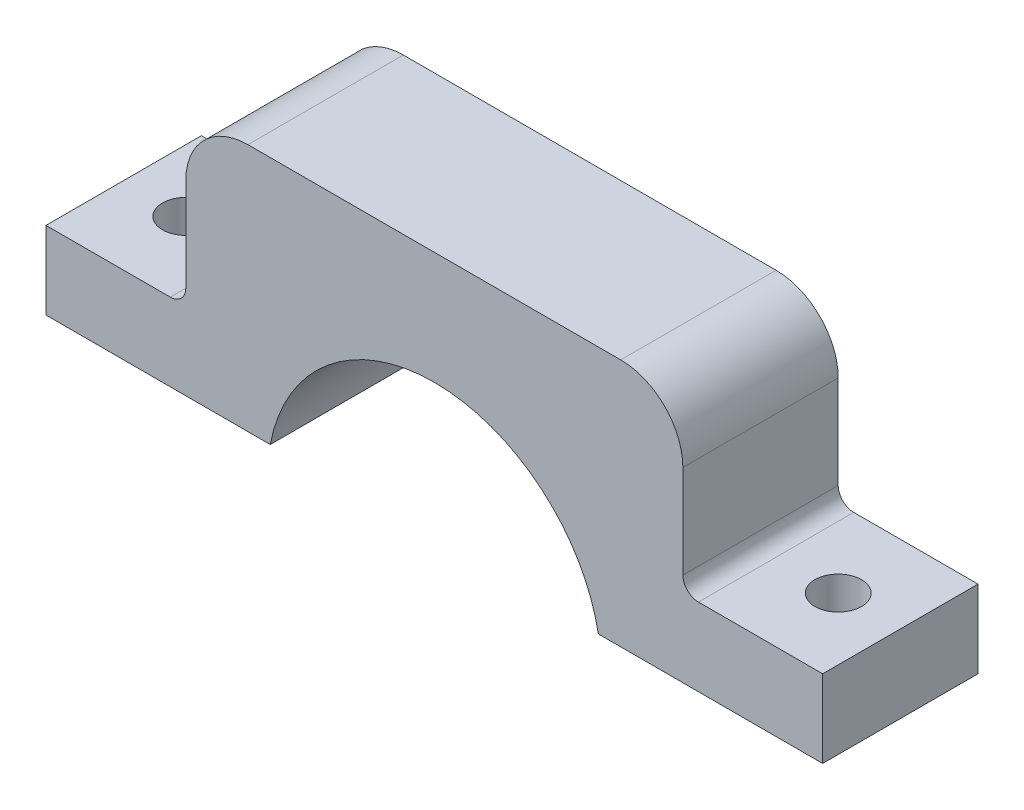
ISO-10303-21;
HEADER;
FILE_DESCRIPTION(('STEP AP214'),'2;1');
FILE_NAME('part.step','',(''),(''),'','','');
FILE_SCHEMA(('AUTOMOTIVE_DESIGN { 1 0 10303 214 1 1 1 1 }'));
ENDSEC;
DATA;
#1=APPLICATION_CONTEXT('core data for automotive mechanical design processes');
#2=APPLICATION_PROTOCOL_DEFINITION('international standard','automotive_design',2000,#1);
#3=PRODUCT_CONTEXT('',#1,'mechanical');
#4=PRODUCT('Part','Part','',(#3));
#5=PRODUCT_RELATED_PRODUCT_CATEGORY('part','',(#4));
#6=PRODUCT_DEFINITION_FORMATION('','',#4);
#7=PRODUCT_DEFINITION_CONTEXT('part definition',#1,'design');
#8=PRODUCT_DEFINITION('design','',#6,#7);
#9=PRODUCT_DEFINITION_SHAPE('','',#8);
#10=(LENGTH_UNIT() NAMED_UNIT(*) SI_UNIT(.MILLI.,.METRE.));
#11=(NAMED_UNIT(*) PLANE_ANGLE_UNIT() SI_UNIT($,.RADIAN.));
#12=(NAMED_UNIT(*) SI_UNIT($,.STERADIAN.) SOLID_ANGLE_UNIT());
#13=UNCERTAINTY_MEASURE_WITH_UNIT(LENGTH_MEASURE(1.E-05),#10,'distance_accuracy_value','');
#14=(GEOMETRIC_REPRESENTATION_CONTEXT(3) GLOBAL_UNCERTAINTY_ASSIGNED_CONTEXT((#13)) GLOBAL_UNIT_ASSIGNED_CONTEXT((#10,
#11,#12)) REPRESENTATION_CONTEXT('',''));
#15=CARTESIAN_POINT('',(0.,0.,0.));
#16=DIRECTION('',(0.,0.,1.));
#17=DIRECTION('',(1.,0.,0.));
#18=AXIS2_PLACEMENT_3D('',#15,#16,#17);
#19=CARTESIAN_POINT('',(16.,0.,10.));
#20=DIRECTION('',(-1.,0.,0.));
#21=DIRECTION('',(0.,0.,1.));
#22=AXIS2_PLACEMENT_3D('',#19,#20,#21);
#23=PLANE('',#22);
#24=DIRECTION('',(0.,1.,0.));
#25=VECTOR('',#24,1.);
#26=CARTESIAN_POINT('',(16.,0.,0.));
#27=LINE('',#26,#25);
#28=CARTESIAN_POINT('',(16.,8.,0.));
#29=VERTEX_POINT('',#28);
#30=CARTESIAN_POINT('',(16.,14.,0.));
#31=VERTEX_POINT('',#30);
#32=EDGE_CURVE('E239',#29,#31,#27,.T.);
#33=ORIENTED_EDGE('',*,*,#32,.T.);
#34=DIRECTION('',(0.,0.,-1.));
#35=VECTOR('',#34,1.);
#36=CARTESIAN_POINT('',(16.,14.,10.));
#37=LINE('',#36,#35);
#38=CARTESIAN_POINT('',(16.,14.,10.));
#39=VERTEX_POINT('',#38);
#40=EDGE_CURVE('E64',#31,#39,#37,.F.);
#41=ORIENTED_EDGE('',*,*,#40,.T.);
#42=DIRECTION('',(0.,1.,0.));
#43=VECTOR('',#42,1.);
#44=CARTESIAN_POINT('',(16.,0.,10.));
#45=LINE('',#44,#43);
#46=CARTESIAN_POINT('',(16.,8.,10.));
#47=VERTEX_POINT('',#46);
#48=EDGE_CURVE('E225',#47,#39,#45,.T.);
#49=ORIENTED_EDGE('',*,*,#48,.F.);
#50=DIRECTION('',(0.,0.,1.));
#51=VECTOR('',#50,1.);
#52=CARTESIAN_POINT('',(16.,8.,10.));
#53=LINE('',#52,#51);
#54=EDGE_CURVE('E255',#47,#29,#53,.F.);
#55=ORIENTED_EDGE('',*,*,#54,.T.);
#56=EDGE_LOOP('',(#33,#41,#49,#55));
#57=FACE_BOUND('',#56,.T.);
#58=ADVANCED_FACE('F40',(#57),#23,.F.);
#59=CARTESIAN_POINT('',(-16.,0.,10.));
#60=DIRECTION('',(-1.,0.,0.));
#61=DIRECTION('',(0.,0.,1.));
#62=AXIS2_PLACEMENT_3D('',#59,#60,#61);
#63=PLANE('',#62);
#64=DIRECTION('',(0.,1.,0.));
#65=VECTOR('',#64,1.);
#66=CARTESIAN_POINT('',(-16.,0.,10.));
#67=LINE('',#66,#65);
#68=CARTESIAN_POINT('',(-16.,8.,10.));
#69=VERTEX_POINT('',#68);
#70=CARTESIAN_POINT('',(-16.,14.,10.));
#71=VERTEX_POINT('',#70);
#72=EDGE_CURVE('E232',#69,#71,#67,.T.);
#73=ORIENTED_EDGE('',*,*,#72,.T.);
#74=DIRECTION('',(0.,0.,-1.));
#75=VECTOR('',#74,1.);
#76=CARTESIAN_POINT('',(-16.,14.,0.));
#77=LINE('',#76,#75);
#78=CARTESIAN_POINT('',(-16.,14.,0.));
#79=VERTEX_POINT('',#78);
#80=EDGE_CURVE('E11',#71,#79,#77,.T.);
#81=ORIENTED_EDGE('',*,*,#80,.T.);
#82=DIRECTION('',(0.,1.,0.));
#83=VECTOR('',#82,1.);
#84=CARTESIAN_POINT('',(-16.,0.,0.));
#85=LINE('',#84,#83);
#86=CARTESIAN_POINT('',(-16.,8.,0.));
#87=VERTEX_POINT('',#86);
#88=EDGE_CURVE('E226',#87,#79,#85,.T.);
#89=ORIENTED_EDGE('',*,*,#88,.F.);
#90=DIRECTION('',(0.,0.,1.));
#91=VECTOR('',#90,1.);
#92=CARTESIAN_POINT('',(-16.,8.,10.));
#93=LINE('',#92,#91);
#94=EDGE_CURVE('E258',#87,#69,#93,.T.);
#95=ORIENTED_EDGE('',*,*,#94,.T.);
#96=EDGE_LOOP('',(#73,#81,#89,#95));
#97=FACE_BOUND('',#96,.T.);
#98=ADVANCED_FACE('F336',(#97),#63,.T.);
#99=CARTESIAN_POINT('',(0.,0.,10.));
#100=DIRECTION('',(0.,0.,-1.));
#101=DIRECTION('',(-1.,0.,0.));
#102=AXIS2_PLACEMENT_3D('',#99,#100,#101);
#103=CYLINDRICAL_SURFACE('',#102,10.75);
#104=DIRECTION('',(0.,0.,-1.));
#105=VECTOR('',#104,1.);
#106=CARTESIAN_POINT('',(10.5623150871388,2.,10.));
#107=LINE('',#106,#105);
#108=CARTESIAN_POINT('',(10.5623150871388,2.,10.));
#109=VERTEX_POINT('',#108);
#110=CARTESIAN_POINT('',(10.5623150871388,2.,0.));
#111=VERTEX_POINT('',#110);
#112=EDGE_CURVE('E219',#109,#111,#107,.T.);
#113=ORIENTED_EDGE('',*,*,#112,.F.);
#114=CARTESIAN_POINT('',(0.,0.,10.));
#115=DIRECTION('',(0.,0.,1.));
#116=DIRECTION('',(1.,0.,0.));
#117=AXIS2_PLACEMENT_3D('',#114,#115,#116);
#118=CIRCLE('',#117,10.75);
#119=CARTESIAN_POINT('',(-10.5623150871388,2.,10.));
#120=VERTEX_POINT('',#119);
#121=EDGE_CURVE('E153',#109,#120,#118,.T.);
#122=ORIENTED_EDGE('',*,*,#121,.T.);
#123=DIRECTION('',(0.,0.,-1.));
#124=VECTOR('',#123,1.);
#125=CARTESIAN_POINT('',(-10.5623150871388,2.,10.));
#126=LINE('',#125,#124);
#127=CARTESIAN_POINT('',(-10.5623150871388,2.,0.));
#128=VERTEX_POINT('',#127);
#129=EDGE_CURVE('E215',#128,#120,#126,.F.);
#130=ORIENTED_EDGE('',*,*,#129,.F.);
#131=CARTESIAN_POINT('',(0.,0.,0.));
#132=DIRECTION('',(0.,0.,1.));
#133=DIRECTION('',(1.,0.,0.));
#134=AXIS2_PLACEMENT_3D('',#131,#132,#133);
#135=CIRCLE('',#134,10.75);
#136=EDGE_CURVE('E222',#111,#128,#135,.T.);
#137=ORIENTED_EDGE('',*,*,#136,.F.);
#138=EDGE_LOOP('',(#113,#122,#130,#137));
#139=FACE_BOUND('',#138,.T.);
#140=ADVANCED_FACE('F350',(#139),#103,.F.);
#141=CARTESIAN_POINT('',(0.,18.,10.));
#142=DIRECTION('',(0.,-1.,0.));
#143=DIRECTION('',(0.,0.,-1.));
#144=AXIS2_PLACEMENT_3D('',#141,#142,#143);
#145=PLANE('',#144);
#146=DIRECTION('',(-1.,0.,0.));
#147=VECTOR('',#146,1.);
#148=CARTESIAN_POINT('',(0.,18.,10.));
#149=LINE('',#148,#147);
#150=CARTESIAN_POINT('',(12.,18.,10.));
#151=VERTEX_POINT('',#150);
#152=CARTESIAN_POINT('',(-12.,18.,10.));
#153=VERTEX_POINT('',#152);
#154=EDGE_CURVE('E229',#151,#153,#149,.T.);
#155=ORIENTED_EDGE('',*,*,#154,.F.);
#156=DIRECTION('',(0.,0.,-1.));
#157=VECTOR('',#156,1.);
#158=CARTESIAN_POINT('',(12.,18.,10.));
#159=LINE('',#158,#157);
#160=CARTESIAN_POINT('',(12.,18.,0.));
#161=VERTEX_POINT('',#160);
#162=EDGE_CURVE('E280',#151,#161,#159,.T.);
#163=ORIENTED_EDGE('',*,*,#162,.T.);
#164=DIRECTION('',(-1.,0.,0.));
#165=VECTOR('',#164,1.);
#166=CARTESIAN_POINT('',(0.,18.,0.));
#167=LINE('',#166,#165);
#168=CARTESIAN_POINT('',(-12.,18.,0.));
#169=VERTEX_POINT('',#168);
#170=EDGE_CURVE('E242',#161,#169,#167,.T.);
#171=ORIENTED_EDGE('',*,*,#170,.T.);
#172=DIRECTION('',(0.,0.,-1.));
#173=VECTOR('',#172,1.);
#174=CARTESIAN_POINT('',(-12.,18.,10.));
#175=LINE('',#174,#173);
#176=EDGE_CURVE('E277',#169,#153,#175,.F.);
#177=ORIENTED_EDGE('',*,*,#176,.T.);
#178=EDGE_LOOP('',(#155,#163,#171,#177));
#179=FACE_BOUND('',#178,.T.);
#180=ADVANCED_FACE('F299',(#179),#145,.F.);
#181=CARTESIAN_POINT('',(0.,0.,10.));
#182=DIRECTION('',(0.,0.,1.));
#183=DIRECTION('',(1.,0.,0.));
#184=AXIS2_PLACEMENT_3D('',#181,#182,#183);
#185=PLANE('',#184);
#186=ORIENTED_EDGE('',*,*,#48,.T.);
#187=CARTESIAN_POINT('',(12.,14.,10.));
#188=DIRECTION('',(0.,0.,1.));
#189=DIRECTION('',(1.,0.,0.));
#190=AXIS2_PLACEMENT_3D('',#187,#188,#189);
#191=CIRCLE('',#190,4.);
#192=EDGE_CURVE('E49',#39,#151,#191,.T.);
#193=ORIENTED_EDGE('',*,*,#192,.T.);
#194=ORIENTED_EDGE('',*,*,#154,.T.);
#195=CARTESIAN_POINT('',(-12.,14.,10.));
#196=DIRECTION('',(0.,0.,1.));
#197=DIRECTION('',(1.,0.,0.));
#198=AXIS2_PLACEMENT_3D('',#195,#196,#197);
#199=CIRCLE('',#198,4.);
#200=EDGE_CURVE('E56',#153,#71,#199,.T.);
#201=ORIENTED_EDGE('',*,*,#200,.T.);
#202=ORIENTED_EDGE('',*,*,#72,.F.);
#203=CARTESIAN_POINT('',(-17.,8.,10.));
#204=DIRECTION('',(0.,0.,1.));
#205=DIRECTION('',(1.,0.,0.));
#206=AXIS2_PLACEMENT_3D('',#203,#204,#205);
#207=CIRCLE('',#206,1.);
#208=CARTESIAN_POINT('',(-17.,7.,10.));
#209=VERTEX_POINT('',#208);
#210=EDGE_CURVE('E271',#69,#209,#207,.F.);
#211=ORIENTED_EDGE('',*,*,#210,.T.);
#212=DIRECTION('',(-1.,0.,0.));
#213=VECTOR('',#212,1.);
#214=CARTESIAN_POINT('',(-16.,7.,10.));
#215=LINE('',#214,#213);
#216=CARTESIAN_POINT('',(-25.,7.,10.));
#217=VERTEX_POINT('',#216);
#218=EDGE_CURVE('E192',#209,#217,#215,.T.);
#219=ORIENTED_EDGE('',*,*,#218,.T.);
#220=DIRECTION('',(0.,-1.,0.));
#221=VECTOR('',#220,1.);
#222=CARTESIAN_POINT('',(-25.,2.,10.));
#223=LINE('',#222,#221);
#224=CARTESIAN_POINT('',(-25.,2.,10.));
#225=VERTEX_POINT('',#224);
#226=EDGE_CURVE('E200',#217,#225,#223,.T.);
#227=ORIENTED_EDGE('',*,*,#226,.T.);
#228=DIRECTION('',(-1.,0.,0.));
#229=VECTOR('',#228,1.);
#230=CARTESIAN_POINT('',(-16.,2.,10.));
#231=LINE('',#230,#229);
#232=EDGE_CURVE('E158',#120,#225,#231,.T.);
#233=ORIENTED_EDGE('',*,*,#232,.F.);
#234=ORIENTED_EDGE('',*,*,#121,.F.);
#235=CARTESIAN_POINT('',(25.,2.,10.));
#236=VERTEX_POINT('',#235);
#237=EDGE_CURVE('E145',#236,#109,#231,.T.);
#238=ORIENTED_EDGE('',*,*,#237,.F.);
#239=DIRECTION('',(0.,1.,0.));
#240=VECTOR('',#239,1.);
#241=CARTESIAN_POINT('',(25.,2.,10.));
#242=LINE('',#241,#240);
#243=CARTESIAN_POINT('',(25.,7.,10.));
#244=VERTEX_POINT('',#243);
#245=EDGE_CURVE('E150',#236,#244,#242,.T.);
#246=ORIENTED_EDGE('',*,*,#245,.T.);
#247=DIRECTION('',(-1.,0.,0.));
#248=VECTOR('',#247,1.);
#249=CARTESIAN_POINT('',(16.,7.,10.));
#250=LINE('',#249,#248);
#251=CARTESIAN_POINT('',(17.,7.,10.));
#252=VERTEX_POINT('',#251);
#253=EDGE_CURVE('E169',#244,#252,#250,.T.);
#254=ORIENTED_EDGE('',*,*,#253,.T.);
#255=CARTESIAN_POINT('',(17.,8.,10.));
#256=DIRECTION('',(0.,0.,1.));
#257=DIRECTION('',(1.,0.,0.));
#258=AXIS2_PLACEMENT_3D('',#255,#256,#257);
#259=CIRCLE('',#258,1.);
#260=EDGE_CURVE('E265',#252,#47,#259,.F.);
#261=ORIENTED_EDGE('',*,*,#260,.T.);
#262=EDGE_LOOP('',(#186,#193,#194,#201,#202,#211,#219,#227,#233,#234,#238,#246,#254,#261));
#263=FACE_BOUND('',#262,.T.);
#264=ADVANCED_FACE('F147',(#263),#185,.T.);
#265=CARTESIAN_POINT('',(0.,0.,0.));
#266=DIRECTION('',(0.,0.,1.));
#267=DIRECTION('',(1.,0.,0.));
#268=AXIS2_PLACEMENT_3D('',#265,#266,#267);
#269=PLANE('',#268);
#270=ORIENTED_EDGE('',*,*,#170,.F.);
#271=CARTESIAN_POINT('',(12.,14.,0.));
#272=DIRECTION('',(0.,0.,1.));
#273=DIRECTION('',(1.,0.,0.));
#274=AXIS2_PLACEMENT_3D('',#271,#272,#273);
#275=CIRCLE('',#274,4.);
#276=EDGE_CURVE('E287',#161,#31,#275,.F.);
#277=ORIENTED_EDGE('',*,*,#276,.T.);
#278=ORIENTED_EDGE('',*,*,#32,.F.);
#279=CARTESIAN_POINT('',(17.,8.,0.));
#280=DIRECTION('',(0.,0.,1.));
#281=DIRECTION('',(1.,0.,0.));
#282=AXIS2_PLACEMENT_3D('',#279,#280,#281);
#283=CIRCLE('',#282,1.);
#284=CARTESIAN_POINT('',(17.,7.,0.));
#285=VERTEX_POINT('',#284);
#286=EDGE_CURVE('E268',#29,#285,#283,.T.);
#287=ORIENTED_EDGE('',*,*,#286,.T.);
#288=DIRECTION('',(1.,0.,0.));
#289=VECTOR('',#288,1.);
#290=CARTESIAN_POINT('',(16.,7.,0.));
#291=LINE('',#290,#289);
#292=CARTESIAN_POINT('',(25.,7.,0.));
#293=VERTEX_POINT('',#292);
#294=EDGE_CURVE('E184',#285,#293,#291,.T.);
#295=ORIENTED_EDGE('',*,*,#294,.T.);
#296=DIRECTION('',(0.,-1.,0.));
#297=VECTOR('',#296,1.);
#298=CARTESIAN_POINT('',(25.,2.,0.));
#299=LINE('',#298,#297);
#300=CARTESIAN_POINT('',(25.,2.,0.));
#301=VERTEX_POINT('',#300);
#302=EDGE_CURVE('E189',#293,#301,#299,.T.);
#303=ORIENTED_EDGE('',*,*,#302,.T.);
#304=DIRECTION('',(-1.,0.,0.));
#305=VECTOR('',#304,1.);
#306=CARTESIAN_POINT('',(-16.,2.,0.));
#307=LINE('',#306,#305);
#308=EDGE_CURVE('E157',#301,#111,#307,.T.);
#309=ORIENTED_EDGE('',*,*,#308,.T.);
#310=ORIENTED_EDGE('',*,*,#136,.T.);
#311=DIRECTION('',(-1.,0.,0.));
#312=VECTOR('',#311,1.);
#313=CARTESIAN_POINT('',(0.,2.,0.));
#314=LINE('',#313,#312);
#315=CARTESIAN_POINT('',(-25.,2.,0.));
#316=VERTEX_POINT('',#315);
#317=EDGE_CURVE('E235',#128,#316,#314,.T.);
#318=ORIENTED_EDGE('',*,*,#317,.T.);
#319=DIRECTION('',(0.,1.,0.));
#320=VECTOR('',#319,1.);
#321=CARTESIAN_POINT('',(-25.,2.,0.));
#322=LINE('',#321,#320);
#323=CARTESIAN_POINT('',(-25.,7.,0.));
#324=VERTEX_POINT('',#323);
#325=EDGE_CURVE('E193',#316,#324,#322,.T.);
#326=ORIENTED_EDGE('',*,*,#325,.T.);
#327=DIRECTION('',(1.,0.,0.));
#328=VECTOR('',#327,1.);
#329=CARTESIAN_POINT('',(-16.,7.,0.));
#330=LINE('',#329,#328);
#331=CARTESIAN_POINT('',(-17.,7.,0.));
#332=VERTEX_POINT('',#331);
#333=EDGE_CURVE('E196',#324,#332,#330,.T.);
#334=ORIENTED_EDGE('',*,*,#333,.T.);
#335=CARTESIAN_POINT('',(-17.,8.,0.));
#336=DIRECTION('',(0.,0.,1.));
#337=DIRECTION('',(1.,0.,0.));
#338=AXIS2_PLACEMENT_3D('',#335,#336,#337);
#339=CIRCLE('',#338,1.);
#340=EDGE_CURVE('E274',#332,#87,#339,.T.);
#341=ORIENTED_EDGE('',*,*,#340,.T.);
#342=ORIENTED_EDGE('',*,*,#88,.T.);
#343=CARTESIAN_POINT('',(-12.,14.,0.));
#344=DIRECTION('',(0.,0.,1.));
#345=DIRECTION('',(1.,0.,0.));
#346=AXIS2_PLACEMENT_3D('',#343,#344,#345);
#347=CIRCLE('',#346,4.);
#348=EDGE_CURVE('E284',#79,#169,#347,.F.);
#349=ORIENTED_EDGE('',*,*,#348,.T.);
#350=EDGE_LOOP('',(#270,#277,#278,#287,#295,#303,#309,#310,#318,#326,#334,#341,#342,#349));
#351=FACE_BOUND('',#350,.T.);
#352=ADVANCED_FACE('F305',(#351),#269,.F.);
#353=CARTESIAN_POINT('',(-16.,2.,0.));
#354=DIRECTION('',(0.,1.,0.));
#355=DIRECTION('',(0.,0.,1.));
#356=AXIS2_PLACEMENT_3D('',#353,#354,#355);
#357=PLANE('',#356);
#358=CARTESIAN_POINT('',(-21.,1.99999999999999,5.));
#359=DIRECTION('',(0.,1.,0.));
#360=DIRECTION('',(1.,0.,0.));
#361=AXIS2_PLACEMENT_3D('',#358,#359,#360);
#362=CIRCLE('',#361,1.5);
#363=CARTESIAN_POINT('',(-19.5,1.99999999999999,5.));
#364=VERTEX_POINT('',#363);
#365=EDGE_CURVE('E512',#364,#364,#362,.T.);
#366=ORIENTED_EDGE('',*,*,#365,.T.);
#367=EDGE_LOOP('',(#366));
#368=FACE_BOUND('',#367,.T.);
#369=ORIENTED_EDGE('',*,*,#129,.T.);
#370=ORIENTED_EDGE('',*,*,#232,.T.);
#371=DIRECTION('',(0.,0.,1.));
#372=VECTOR('',#371,1.);
#373=CARTESIAN_POINT('',(-25.,2.,-10.295630140987));
#374=LINE('',#373,#372);
#375=EDGE_CURVE('E197',#316,#225,#374,.T.);
#376=ORIENTED_EDGE('',*,*,#375,.F.);
#377=ORIENTED_EDGE('',*,*,#317,.F.);
#378=EDGE_LOOP('',(#369,#370,#376,#377));
#379=FACE_BOUND('',#378,.T.);
#380=ADVANCED_FACE('F318',(#368,#379),#357,.F.);
#381=CARTESIAN_POINT('',(21.,2.,5.));
#382=DIRECTION('',(0.,1.,0.));
#383=DIRECTION('',(-1.,0.,0.));
#384=AXIS2_PLACEMENT_3D('',#381,#382,#383);
#385=CIRCLE('',#384,1.5);
#386=CARTESIAN_POINT('',(19.5,2.,5.));
#387=VERTEX_POINT('',#386);
#388=EDGE_CURVE('E175',#387,#387,#385,.T.);
#389=ORIENTED_EDGE('',*,*,#388,.T.);
#390=EDGE_LOOP('',(#389));
#391=FACE_BOUND('',#390,.T.);
#392=ORIENTED_EDGE('',*,*,#112,.T.);
#393=ORIENTED_EDGE('',*,*,#308,.F.);
#394=DIRECTION('',(0.,0.,1.));
#395=VECTOR('',#394,1.);
#396=CARTESIAN_POINT('',(25.,2.,-10.295630140987));
#397=LINE('',#396,#395);
#398=EDGE_CURVE('E161',#301,#236,#397,.T.);
#399=ORIENTED_EDGE('',*,*,#398,.T.);
#400=ORIENTED_EDGE('',*,*,#237,.T.);
#401=EDGE_LOOP('',(#392,#393,#399,#400));
#402=FACE_BOUND('',#401,.T.);
#403=ADVANCED_FACE('F162',(#391,#402),#357,.F.);
#404=CARTESIAN_POINT('',(-25.,2.,-10.295630140987));
#405=DIRECTION('',(-1.,0.,0.));
#406=DIRECTION('',(0.,0.,1.));
#407=AXIS2_PLACEMENT_3D('',#404,#405,#406);
#408=PLANE('',#407);
#409=ORIENTED_EDGE('',*,*,#325,.F.);
#410=ORIENTED_EDGE('',*,*,#375,.T.);
#411=ORIENTED_EDGE('',*,*,#226,.F.);
#412=DIRECTION('',(0.,0.,1.));
#413=VECTOR('',#412,1.);
#414=CARTESIAN_POINT('',(-25.,7.,-10.295630140987));
#415=LINE('',#414,#413);
#416=EDGE_CURVE('E204',#324,#217,#415,.T.);
#417=ORIENTED_EDGE('',*,*,#416,.F.);
#418=EDGE_LOOP('',(#409,#410,#411,#417));
#419=FACE_BOUND('',#418,.T.);
#420=ADVANCED_FACE('F323',(#419),#408,.T.);
#421=CARTESIAN_POINT('',(-16.,7.,-10.295630140987));
#422=DIRECTION('',(0.,1.,0.));
#423=DIRECTION('',(-1.,0.,0.));
#424=AXIS2_PLACEMENT_3D('',#421,#422,#423);
#425=PLANE('',#424);
#426=CARTESIAN_POINT('',(-21.,7.,5.));
#427=DIRECTION('',(0.,1.,0.));
#428=DIRECTION('',(1.,0.,0.));
#429=AXIS2_PLACEMENT_3D('',#426,#427,#428);
#430=CIRCLE('',#429,1.5);
#431=CARTESIAN_POINT('',(-19.5,7.,5.));
#432=VERTEX_POINT('',#431);
#433=EDGE_CURVE('E514',#432,#432,#430,.T.);
#434=ORIENTED_EDGE('',*,*,#433,.F.);
#435=EDGE_LOOP('',(#434));
#436=FACE_BOUND('',#435,.T.);
#437=ORIENTED_EDGE('',*,*,#218,.F.);
#438=DIRECTION('',(0.,0.,1.));
#439=VECTOR('',#438,1.);
#440=CARTESIAN_POINT('',(-17.,7.,0.));
#441=LINE('',#440,#439);
#442=EDGE_CURVE('E262',#209,#332,#441,.F.);
#443=ORIENTED_EDGE('',*,*,#442,.T.);
#444=ORIENTED_EDGE('',*,*,#333,.F.);
#445=ORIENTED_EDGE('',*,*,#416,.T.);
#446=EDGE_LOOP('',(#437,#443,#444,#445));
#447=FACE_BOUND('',#446,.T.);
#448=ADVANCED_FACE('F329',(#436,#447),#425,.T.);
#449=CARTESIAN_POINT('',(16.,7.,-10.295630140987));
#450=DIRECTION('',(0.,1.,0.));
#451=DIRECTION('',(-1.,0.,0.));
#452=AXIS2_PLACEMENT_3D('',#449,#450,#451);
#453=PLANE('',#452);
#454=CARTESIAN_POINT('',(21.,7.,5.));
#455=DIRECTION('',(0.,1.,0.));
#456=DIRECTION('',(-1.,0.,0.));
#457=AXIS2_PLACEMENT_3D('',#454,#455,#456);
#458=CIRCLE('',#457,1.5);
#459=CARTESIAN_POINT('',(19.5,7.,5.));
#460=VERTEX_POINT('',#459);
#461=EDGE_CURVE('E181',#460,#460,#458,.T.);
#462=ORIENTED_EDGE('',*,*,#461,.F.);
#463=EDGE_LOOP('',(#462));
#464=FACE_BOUND('',#463,.T.);
#465=ORIENTED_EDGE('',*,*,#294,.F.);
#466=DIRECTION('',(0.,0.,1.));
#467=VECTOR('',#466,1.);
#468=CARTESIAN_POINT('',(17.,7.,-10.295630140987));
#469=LINE('',#468,#467);
#470=EDGE_CURVE('E251',#285,#252,#469,.T.);
#471=ORIENTED_EDGE('',*,*,#470,.T.);
#472=ORIENTED_EDGE('',*,*,#253,.F.);
#473=DIRECTION('',(0.,0.,1.));
#474=VECTOR('',#473,1.);
#475=CARTESIAN_POINT('',(25.,7.,-10.295630140987));
#476=LINE('',#475,#474);
#477=EDGE_CURVE('E168',#293,#244,#476,.T.);
#478=ORIENTED_EDGE('',*,*,#477,.F.);
#479=EDGE_LOOP('',(#465,#471,#472,#478));
#480=FACE_BOUND('',#479,.T.);
#481=ADVANCED_FACE('F313',(#464,#480),#453,.T.);
#482=CARTESIAN_POINT('',(25.,2.,-10.295630140987));
#483=DIRECTION('',(1.,0.,0.));
#484=DIRECTION('',(0.,1.,0.));
#485=AXIS2_PLACEMENT_3D('',#482,#483,#484);
#486=PLANE('',#485);
#487=ORIENTED_EDGE('',*,*,#302,.F.);
#488=ORIENTED_EDGE('',*,*,#477,.T.);
#489=ORIENTED_EDGE('',*,*,#245,.F.);
#490=ORIENTED_EDGE('',*,*,#398,.F.);
#491=EDGE_LOOP('',(#487,#488,#489,#490));
#492=FACE_BOUND('',#491,.T.);
#493=ADVANCED_FACE('F171',(#492),#486,.T.);
#494=CARTESIAN_POINT('',(17.,8.,-10.295630140987));
#495=DIRECTION('',(0.,0.,1.));
#496=DIRECTION('',(1.,0.,0.));
#497=AXIS2_PLACEMENT_3D('',#494,#495,#496);
#498=CYLINDRICAL_SURFACE('',#497,1.);
#499=ORIENTED_EDGE('',*,*,#286,.F.);
#500=ORIENTED_EDGE('',*,*,#54,.F.);
#501=ORIENTED_EDGE('',*,*,#260,.F.);
#502=ORIENTED_EDGE('',*,*,#470,.F.);
#503=EDGE_LOOP('',(#499,#500,#501,#502));
#504=FACE_BOUND('',#503,.T.);
#505=ADVANCED_FACE('F309',(#504),#498,.F.);
#506=CARTESIAN_POINT('',(-17.,8.,10.));
#507=DIRECTION('',(0.,0.,-1.));
#508=DIRECTION('',(-1.,0.,0.));
#509=AXIS2_PLACEMENT_3D('',#506,#507,#508);
#510=CYLINDRICAL_SURFACE('',#509,1.);
#511=ORIENTED_EDGE('',*,*,#340,.F.);
#512=ORIENTED_EDGE('',*,*,#442,.F.);
#513=ORIENTED_EDGE('',*,*,#210,.F.);
#514=ORIENTED_EDGE('',*,*,#94,.F.);
#515=EDGE_LOOP('',(#511,#512,#513,#514));
#516=FACE_BOUND('',#515,.T.);
#517=ADVANCED_FACE('F334',(#516),#510,.F.);
#518=CARTESIAN_POINT('',(21.,2.,5.));
#519=DIRECTION('',(0.,1.,0.));
#520=DIRECTION('',(-1.,0.,0.));
#521=AXIS2_PLACEMENT_3D('',#518,#519,#520);
#522=CYLINDRICAL_SURFACE('',#521,1.5);
#523=ORIENTED_EDGE('',*,*,#388,.F.);
#524=EDGE_LOOP('',(#523));
#525=FACE_BOUND('',#524,.T.);
#526=ORIENTED_EDGE('',*,*,#461,.T.);
#527=EDGE_LOOP('',(#526));
#528=FACE_BOUND('',#527,.T.);
#529=ADVANCED_FACE('F360',(#525,#528),#522,.F.);
#530=CARTESIAN_POINT('',(-21.,1.99999999999999,5.));
#531=DIRECTION('',(0.,1.,0.));
#532=DIRECTION('',(-1.,0.,0.));
#533=AXIS2_PLACEMENT_3D('',#530,#531,#532);
#534=CYLINDRICAL_SURFACE('',#533,1.5);
#535=ORIENTED_EDGE('',*,*,#365,.F.);
#536=EDGE_LOOP('',(#535));
#537=FACE_BOUND('',#536,.T.);
#538=ORIENTED_EDGE('',*,*,#433,.T.);
#539=EDGE_LOOP('',(#538));
#540=FACE_BOUND('',#539,.T.);
#541=ADVANCED_FACE('F343',(#537,#540),#534,.F.);
#542=CARTESIAN_POINT('',(12.,14.,10.));
#543=DIRECTION('',(0.,0.,-1.));
#544=DIRECTION('',(-1.,0.,0.));
#545=AXIS2_PLACEMENT_3D('',#542,#543,#544);
#546=CYLINDRICAL_SURFACE('',#545,4.);
#547=ORIENTED_EDGE('',*,*,#192,.F.);
#548=ORIENTED_EDGE('',*,*,#40,.F.);
#549=ORIENTED_EDGE('',*,*,#276,.F.);
#550=ORIENTED_EDGE('',*,*,#162,.F.);
#551=EDGE_LOOP('',(#547,#548,#549,#550));
#552=FACE_BOUND('',#551,.T.);
#553=ADVANCED_FACE('F302',(#552),#546,.T.);
#554=CARTESIAN_POINT('',(-12.,14.,10.));
#555=DIRECTION('',(0.,0.,1.));
#556=DIRECTION('',(1.,0.,0.));
#557=AXIS2_PLACEMENT_3D('',#554,#555,#556);
#558=CYLINDRICAL_SURFACE('',#557,4.);
#559=ORIENTED_EDGE('',*,*,#200,.F.);
#560=ORIENTED_EDGE('',*,*,#176,.F.);
#561=ORIENTED_EDGE('',*,*,#348,.F.);
#562=ORIENTED_EDGE('',*,*,#80,.F.);
#563=EDGE_LOOP('',(#559,#560,#561,#562));
#564=FACE_BOUND('',#563,.T.);
#565=ADVANCED_FACE('F42',(#564),#558,.T.);
#566=CLOSED_SHELL('',(#58,#98,#140,#180,#264,#352,#380,#403,#420,#448,#481,#493,#505,#517,#529,
#541,#553,#565));
#567=MANIFOLD_SOLID_BREP('B2',#566);
#568=ADVANCED_BREP_SHAPE_REPRESENTATION('',(#18,#567),#14);
#569=SHAPE_DEFINITION_REPRESENTATION(#9,#568);
ENDSEC;
END-ISO-10303-21;
